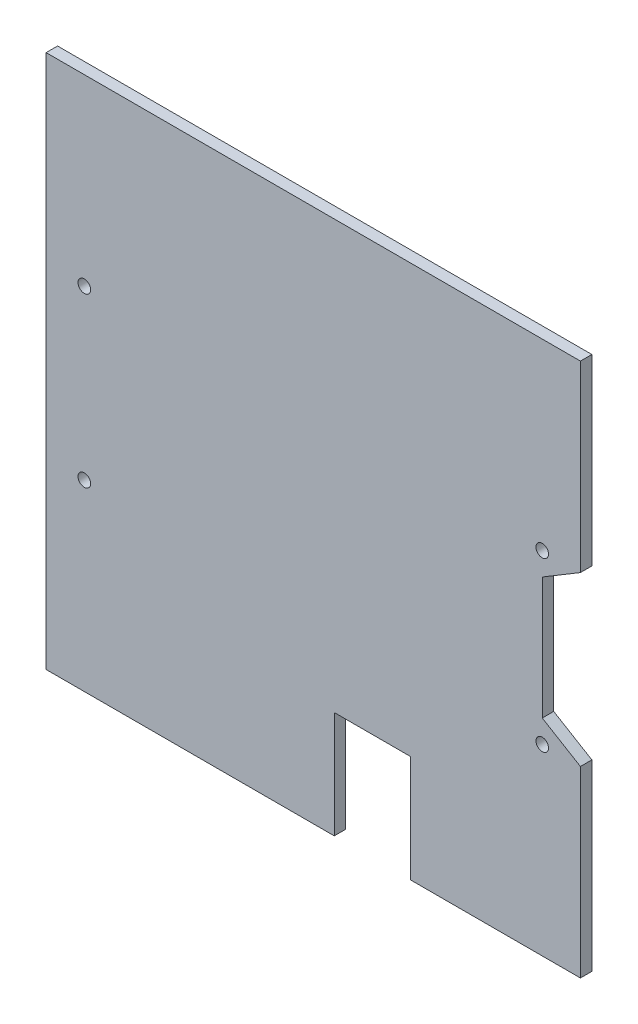
ISO-10303-21;
HEADER;
FILE_DESCRIPTION(('STEP AP214'),'2;1');
FILE_NAME('part.step','',(''),(''),'','','');
FILE_SCHEMA(('AUTOMOTIVE_DESIGN { 1 0 10303 214 1 1 1 1 }'));
ENDSEC;
DATA;
#1=APPLICATION_CONTEXT('core data for automotive mechanical design processes');
#2=APPLICATION_PROTOCOL_DEFINITION('international standard','automotive_design',2000,#1);
#3=PRODUCT_CONTEXT('',#1,'mechanical');
#4=PRODUCT('Part','Part','',(#3));
#5=PRODUCT_RELATED_PRODUCT_CATEGORY('part','',(#4));
#6=PRODUCT_DEFINITION_FORMATION('','',#4);
#7=PRODUCT_DEFINITION_CONTEXT('part definition',#1,'design');
#8=PRODUCT_DEFINITION('design','',#6,#7);
#9=PRODUCT_DEFINITION_SHAPE('','',#8);
#10=(LENGTH_UNIT() NAMED_UNIT(*) SI_UNIT(.MILLI.,.METRE.));
#11=(NAMED_UNIT(*) PLANE_ANGLE_UNIT() SI_UNIT($,.RADIAN.));
#12=(NAMED_UNIT(*) SI_UNIT($,.STERADIAN.) SOLID_ANGLE_UNIT());
#13=UNCERTAINTY_MEASURE_WITH_UNIT(LENGTH_MEASURE(1.E-05),#10,'distance_accuracy_value','');
#14=(GEOMETRIC_REPRESENTATION_CONTEXT(3) GLOBAL_UNCERTAINTY_ASSIGNED_CONTEXT((#13)) GLOBAL_UNIT_ASSIGNED_CONTEXT((#10,
#11,#12)) REPRESENTATION_CONTEXT('',''));
#15=CARTESIAN_POINT('',(0.,0.,0.));
#16=DIRECTION('',(0.,0.,1.));
#17=DIRECTION('',(1.,0.,0.));
#18=AXIS2_PLACEMENT_3D('',#15,#16,#17);
#19=CARTESIAN_POINT('',(0.,-26.,3.));
#20=DIRECTION('',(0.,0.,1.));
#21=DIRECTION('',(1.,0.,0.));
#22=AXIS2_PLACEMENT_3D('',#19,#20,#21);
#23=PLANE('',#22);
#24=CARTESIAN_POINT('',(10.,22.,3.));
#25=DIRECTION('',(0.,0.,1.));
#26=DIRECTION('',(1.,0.,0.));
#27=AXIS2_PLACEMENT_3D('',#24,#25,#26);
#28=CIRCLE('',#27,1.65);
#29=CARTESIAN_POINT('',(11.65,22.,3.));
#30=VERTEX_POINT('',#29);
#31=EDGE_CURVE('E291',#30,#30,#28,.T.);
#32=ORIENTED_EDGE('',*,*,#31,.F.);
#33=EDGE_LOOP('',(#32));
#34=FACE_BOUND('',#33,.T.);
#35=CARTESIAN_POINT('',(130.,66.,3.));
#36=DIRECTION('',(0.,0.,1.));
#37=DIRECTION('',(-1.,0.,0.));
#38=AXIS2_PLACEMENT_3D('',#35,#36,#37);
#39=CIRCLE('',#38,1.65000000000002);
#40=CARTESIAN_POINT('',(128.35,66.,3.));
#41=VERTEX_POINT('',#40);
#42=EDGE_CURVE('E157',#41,#41,#39,.T.);
#43=ORIENTED_EDGE('',*,*,#42,.F.);
#44=EDGE_LOOP('',(#43));
#45=FACE_BOUND('',#44,.T.);
#46=DIRECTION('',(0.,-1.,0.));
#47=VECTOR('',#46,1.);
#48=CARTESIAN_POINT('',(0.,114.,3.));
#49=LINE('',#48,#47);
#50=CARTESIAN_POINT('',(0.,114.,3.));
#51=VERTEX_POINT('',#50);
#52=CARTESIAN_POINT('',(0.,-26.,3.));
#53=VERTEX_POINT('',#52);
#54=EDGE_CURVE('E176',#51,#53,#49,.T.);
#55=ORIENTED_EDGE('',*,*,#54,.T.);
#56=DIRECTION('',(1.,0.,0.));
#57=VECTOR('',#56,1.);
#58=CARTESIAN_POINT('',(0.,-26.,3.));
#59=LINE('',#58,#57);
#60=CARTESIAN_POINT('',(75.5,-26.,3.));
#61=VERTEX_POINT('',#60);
#62=EDGE_CURVE('E104',#53,#61,#59,.T.);
#63=ORIENTED_EDGE('',*,*,#62,.T.);
#64=DIRECTION('',(0.,1.,0.));
#65=VECTOR('',#64,1.);
#66=CARTESIAN_POINT('',(75.5,-26.,3.));
#67=LINE('',#66,#65);
#68=CARTESIAN_POINT('',(75.5,1.99999999999998,3.));
#69=VERTEX_POINT('',#68);
#70=EDGE_CURVE('E203',#61,#69,#67,.T.);
#71=ORIENTED_EDGE('',*,*,#70,.T.);
#72=DIRECTION('',(1.,0.,0.));
#73=VECTOR('',#72,1.);
#74=CARTESIAN_POINT('',(75.5,1.99999999999998,3.));
#75=LINE('',#74,#73);
#76=CARTESIAN_POINT('',(95.5,1.99999999999999,3.));
#77=VERTEX_POINT('',#76);
#78=EDGE_CURVE('E222',#69,#77,#75,.T.);
#79=ORIENTED_EDGE('',*,*,#78,.T.);
#80=DIRECTION('',(0.,-1.,0.));
#81=VECTOR('',#80,1.);
#82=CARTESIAN_POINT('',(95.5,-26.,3.));
#83=LINE('',#82,#81);
#84=CARTESIAN_POINT('',(95.5,-26.,3.));
#85=VERTEX_POINT('',#84);
#86=EDGE_CURVE('E219',#77,#85,#83,.T.);
#87=ORIENTED_EDGE('',*,*,#86,.T.);
#88=DIRECTION('',(1.,0.,0.));
#89=VECTOR('',#88,1.);
#90=CARTESIAN_POINT('',(95.5,-26.,3.));
#91=LINE('',#90,#89);
#92=CARTESIAN_POINT('',(140.,-26.,3.));
#93=VERTEX_POINT('',#92);
#94=EDGE_CURVE('E221',#85,#93,#91,.T.);
#95=ORIENTED_EDGE('',*,*,#94,.T.);
#96=DIRECTION('',(0.,1.,0.));
#97=VECTOR('',#96,1.);
#98=CARTESIAN_POINT('',(140.,-26.,3.));
#99=LINE('',#98,#97);
#100=CARTESIAN_POINT('',(140.,21.9999999999925,3.));
#101=VERTEX_POINT('',#100);
#102=EDGE_CURVE('E224',#93,#101,#99,.T.);
#103=ORIENTED_EDGE('',*,*,#102,.T.);
#104=DIRECTION('',(-0.857492925712261,0.514495755427998,0.));
#105=VECTOR('',#104,1.);
#106=CARTESIAN_POINT('',(130.,28.,3.));
#107=LINE('',#106,#105);
#108=CARTESIAN_POINT('',(130.,28.,3.));
#109=VERTEX_POINT('',#108);
#110=EDGE_CURVE('E230',#101,#109,#107,.T.);
#111=ORIENTED_EDGE('',*,*,#110,.T.);
#112=DIRECTION('',(0.,1.,0.));
#113=VECTOR('',#112,1.);
#114=CARTESIAN_POINT('',(130.,60.,3.));
#115=LINE('',#114,#113);
#116=CARTESIAN_POINT('',(130.,60.,3.));
#117=VERTEX_POINT('',#116);
#118=EDGE_CURVE('E135',#109,#117,#115,.T.);
#119=ORIENTED_EDGE('',*,*,#118,.T.);
#120=DIRECTION('',(0.857492925712262,0.514495755427997,0.));
#121=VECTOR('',#120,1.);
#122=CARTESIAN_POINT('',(130.,60.,3.));
#123=LINE('',#122,#121);
#124=CARTESIAN_POINT('',(140.,66.0000000000075,3.));
#125=VERTEX_POINT('',#124);
#126=EDGE_CURVE('E129',#117,#125,#123,.T.);
#127=ORIENTED_EDGE('',*,*,#126,.T.);
#128=DIRECTION('',(0.,1.,0.));
#129=VECTOR('',#128,1.);
#130=CARTESIAN_POINT('',(140.,114.,3.));
#131=LINE('',#130,#129);
#132=CARTESIAN_POINT('',(140.,114.,3.));
#133=VERTEX_POINT('',#132);
#134=EDGE_CURVE('E133',#125,#133,#131,.T.);
#135=ORIENTED_EDGE('',*,*,#134,.T.);
#136=DIRECTION('',(-1.,0.,0.));
#137=VECTOR('',#136,1.);
#138=CARTESIAN_POINT('',(0.,114.,3.));
#139=LINE('',#138,#137);
#140=EDGE_CURVE('E49',#133,#51,#139,.T.);
#141=ORIENTED_EDGE('',*,*,#140,.T.);
#142=EDGE_LOOP('',(#55,#63,#71,#79,#87,#95,#103,#111,#119,#127,#135,#141));
#143=FACE_BOUND('',#142,.T.);
#144=CARTESIAN_POINT('',(10.,66.,3.));
#145=DIRECTION('',(0.,0.,1.));
#146=DIRECTION('',(-1.,0.,0.));
#147=AXIS2_PLACEMENT_3D('',#144,#145,#146);
#148=CIRCLE('',#147,1.65);
#149=CARTESIAN_POINT('',(8.35000000000001,66.,3.));
#150=VERTEX_POINT('',#149);
#151=EDGE_CURVE('E297',#150,#150,#148,.T.);
#152=ORIENTED_EDGE('',*,*,#151,.F.);
#153=EDGE_LOOP('',(#152));
#154=FACE_BOUND('',#153,.T.);
#155=CARTESIAN_POINT('',(130.,22.,3.));
#156=DIRECTION('',(0.,0.,1.));
#157=DIRECTION('',(1.,0.,0.));
#158=AXIS2_PLACEMENT_3D('',#155,#156,#157);
#159=CIRCLE('',#158,1.65000000000002);
#160=CARTESIAN_POINT('',(131.65,22.,3.));
#161=VERTEX_POINT('',#160);
#162=EDGE_CURVE('E282',#161,#161,#159,.T.);
#163=ORIENTED_EDGE('',*,*,#162,.F.);
#164=EDGE_LOOP('',(#163));
#165=FACE_BOUND('',#164,.T.);
#166=ADVANCED_FACE('F32',(#34,#45,#143,#154,#165),#23,.T.);
#167=CARTESIAN_POINT('',(0.,-26.,0.));
#168=DIRECTION('',(0.,0.,1.));
#169=DIRECTION('',(1.,0.,0.));
#170=AXIS2_PLACEMENT_3D('',#167,#168,#169);
#171=PLANE('',#170);
#172=CARTESIAN_POINT('',(10.,22.,0.));
#173=DIRECTION('',(0.,0.,1.));
#174=DIRECTION('',(1.,0.,0.));
#175=AXIS2_PLACEMENT_3D('',#172,#173,#174);
#176=CIRCLE('',#175,1.65);
#177=CARTESIAN_POINT('',(11.65,22.,0.));
#178=VERTEX_POINT('',#177);
#179=EDGE_CURVE('E288',#178,#178,#176,.T.);
#180=ORIENTED_EDGE('',*,*,#179,.T.);
#181=EDGE_LOOP('',(#180));
#182=FACE_BOUND('',#181,.T.);
#183=CARTESIAN_POINT('',(130.,66.,0.));
#184=DIRECTION('',(0.,0.,1.));
#185=DIRECTION('',(-1.,0.,0.));
#186=AXIS2_PLACEMENT_3D('',#183,#184,#185);
#187=CIRCLE('',#186,1.65000000000002);
#188=CARTESIAN_POINT('',(128.35,66.,0.));
#189=VERTEX_POINT('',#188);
#190=EDGE_CURVE('E300',#189,#189,#187,.T.);
#191=ORIENTED_EDGE('',*,*,#190,.T.);
#192=EDGE_LOOP('',(#191));
#193=FACE_BOUND('',#192,.T.);
#194=DIRECTION('',(0.,-1.,0.));
#195=VECTOR('',#194,1.);
#196=CARTESIAN_POINT('',(0.,114.,0.));
#197=LINE('',#196,#195);
#198=CARTESIAN_POINT('',(0.,114.,0.));
#199=VERTEX_POINT('',#198);
#200=CARTESIAN_POINT('',(0.,-26.,0.));
#201=VERTEX_POINT('',#200);
#202=EDGE_CURVE('E153',#199,#201,#197,.T.);
#203=ORIENTED_EDGE('',*,*,#202,.F.);
#204=DIRECTION('',(-1.,0.,0.));
#205=VECTOR('',#204,1.);
#206=CARTESIAN_POINT('',(0.,114.,0.));
#207=LINE('',#206,#205);
#208=CARTESIAN_POINT('',(140.,114.,0.));
#209=VERTEX_POINT('',#208);
#210=EDGE_CURVE('E96',#209,#199,#207,.T.);
#211=ORIENTED_EDGE('',*,*,#210,.F.);
#212=DIRECTION('',(0.,1.,0.));
#213=VECTOR('',#212,1.);
#214=CARTESIAN_POINT('',(140.,114.,0.));
#215=LINE('',#214,#213);
#216=CARTESIAN_POINT('',(140.,66.0000000000075,0.));
#217=VERTEX_POINT('',#216);
#218=EDGE_CURVE('E90',#217,#209,#215,.T.);
#219=ORIENTED_EDGE('',*,*,#218,.F.);
#220=DIRECTION('',(0.857492925712262,0.514495755427997,0.));
#221=VECTOR('',#220,1.);
#222=CARTESIAN_POINT('',(130.,60.,0.));
#223=LINE('',#222,#221);
#224=CARTESIAN_POINT('',(130.,60.,0.));
#225=VERTEX_POINT('',#224);
#226=EDGE_CURVE('E143',#225,#217,#223,.T.);
#227=ORIENTED_EDGE('',*,*,#226,.F.);
#228=DIRECTION('',(0.,1.,0.));
#229=VECTOR('',#228,1.);
#230=CARTESIAN_POINT('',(130.,60.,0.));
#231=LINE('',#230,#229);
#232=CARTESIAN_POINT('',(130.,28.,0.));
#233=VERTEX_POINT('',#232);
#234=EDGE_CURVE('E171',#233,#225,#231,.T.);
#235=ORIENTED_EDGE('',*,*,#234,.F.);
#236=DIRECTION('',(-0.857492925712261,0.514495755427998,0.));
#237=VECTOR('',#236,1.);
#238=CARTESIAN_POINT('',(130.,28.,0.));
#239=LINE('',#238,#237);
#240=CARTESIAN_POINT('',(140.,21.9999999999925,0.));
#241=VERTEX_POINT('',#240);
#242=EDGE_CURVE('E169',#241,#233,#239,.T.);
#243=ORIENTED_EDGE('',*,*,#242,.F.);
#244=DIRECTION('',(0.,1.,0.));
#245=VECTOR('',#244,1.);
#246=CARTESIAN_POINT('',(140.,-26.,0.));
#247=LINE('',#246,#245);
#248=CARTESIAN_POINT('',(140.,-26.,0.));
#249=VERTEX_POINT('',#248);
#250=EDGE_CURVE('E167',#249,#241,#247,.T.);
#251=ORIENTED_EDGE('',*,*,#250,.F.);
#252=DIRECTION('',(1.,0.,0.));
#253=VECTOR('',#252,1.);
#254=CARTESIAN_POINT('',(95.5,-26.,0.));
#255=LINE('',#254,#253);
#256=CARTESIAN_POINT('',(95.5,-26.,0.));
#257=VERTEX_POINT('',#256);
#258=EDGE_CURVE('E165',#257,#249,#255,.T.);
#259=ORIENTED_EDGE('',*,*,#258,.F.);
#260=DIRECTION('',(0.,-1.,0.));
#261=VECTOR('',#260,1.);
#262=CARTESIAN_POINT('',(95.5,-26.,0.));
#263=LINE('',#262,#261);
#264=CARTESIAN_POINT('',(95.5,1.99999999999999,0.));
#265=VERTEX_POINT('',#264);
#266=EDGE_CURVE('E163',#265,#257,#263,.T.);
#267=ORIENTED_EDGE('',*,*,#266,.F.);
#268=DIRECTION('',(1.,0.,0.));
#269=VECTOR('',#268,1.);
#270=CARTESIAN_POINT('',(75.5,1.99999999999998,0.));
#271=LINE('',#270,#269);
#272=CARTESIAN_POINT('',(75.5,1.99999999999998,0.));
#273=VERTEX_POINT('',#272);
#274=EDGE_CURVE('E161',#273,#265,#271,.T.);
#275=ORIENTED_EDGE('',*,*,#274,.F.);
#276=DIRECTION('',(0.,1.,0.));
#277=VECTOR('',#276,1.);
#278=CARTESIAN_POINT('',(75.5,-26.,0.));
#279=LINE('',#278,#277);
#280=CARTESIAN_POINT('',(75.5,-26.,0.));
#281=VERTEX_POINT('',#280);
#282=EDGE_CURVE('E159',#281,#273,#279,.T.);
#283=ORIENTED_EDGE('',*,*,#282,.F.);
#284=DIRECTION('',(1.,0.,0.));
#285=VECTOR('',#284,1.);
#286=CARTESIAN_POINT('',(0.,-26.,0.));
#287=LINE('',#286,#285);
#288=EDGE_CURVE('E156',#201,#281,#287,.T.);
#289=ORIENTED_EDGE('',*,*,#288,.F.);
#290=EDGE_LOOP('',(#203,#211,#219,#227,#235,#243,#251,#259,#267,#275,#283,#289));
#291=FACE_BOUND('',#290,.T.);
#292=CARTESIAN_POINT('',(10.,66.,0.));
#293=DIRECTION('',(0.,0.,1.));
#294=DIRECTION('',(-1.,0.,0.));
#295=AXIS2_PLACEMENT_3D('',#292,#293,#294);
#296=CIRCLE('',#295,1.65);
#297=CARTESIAN_POINT('',(8.35000000000001,66.,0.));
#298=VERTEX_POINT('',#297);
#299=EDGE_CURVE('E294',#298,#298,#296,.T.);
#300=ORIENTED_EDGE('',*,*,#299,.T.);
#301=EDGE_LOOP('',(#300));
#302=FACE_BOUND('',#301,.T.);
#303=CARTESIAN_POINT('',(130.,22.,0.));
#304=DIRECTION('',(0.,0.,1.));
#305=DIRECTION('',(1.,0.,0.));
#306=AXIS2_PLACEMENT_3D('',#303,#304,#305);
#307=CIRCLE('',#306,1.65000000000002);
#308=CARTESIAN_POINT('',(131.65,22.,0.));
#309=VERTEX_POINT('',#308);
#310=EDGE_CURVE('E285',#309,#309,#307,.T.);
#311=ORIENTED_EDGE('',*,*,#310,.T.);
#312=EDGE_LOOP('',(#311));
#313=FACE_BOUND('',#312,.T.);
#314=ADVANCED_FACE('F207',(#182,#193,#291,#302,#313),#171,.F.);
#315=CARTESIAN_POINT('',(0.,114.,3.));
#316=DIRECTION('',(1.,0.,0.));
#317=DIRECTION('',(0.,1.,0.));
#318=AXIS2_PLACEMENT_3D('',#315,#316,#317);
#319=PLANE('',#318);
#320=ORIENTED_EDGE('',*,*,#202,.T.);
#321=DIRECTION('',(0.,0.,-1.));
#322=VECTOR('',#321,1.);
#323=CARTESIAN_POINT('',(0.,-26.,3.));
#324=LINE('',#323,#322);
#325=EDGE_CURVE('E11',#53,#201,#324,.T.);
#326=ORIENTED_EDGE('',*,*,#325,.F.);
#327=ORIENTED_EDGE('',*,*,#54,.F.);
#328=DIRECTION('',(0.,0.,-1.));
#329=VECTOR('',#328,1.);
#330=CARTESIAN_POINT('',(0.,114.,3.));
#331=LINE('',#330,#329);
#332=EDGE_CURVE('E149',#51,#199,#331,.T.);
#333=ORIENTED_EDGE('',*,*,#332,.T.);
#334=EDGE_LOOP('',(#320,#326,#327,#333));
#335=FACE_BOUND('',#334,.T.);
#336=ADVANCED_FACE('F34',(#335),#319,.F.);
#337=CARTESIAN_POINT('',(0.,-26.,3.));
#338=DIRECTION('',(0.,1.,0.));
#339=DIRECTION('',(-1.,0.,0.));
#340=AXIS2_PLACEMENT_3D('',#337,#338,#339);
#341=PLANE('',#340);
#342=ORIENTED_EDGE('',*,*,#288,.T.);
#343=DIRECTION('',(0.,0.,-1.));
#344=VECTOR('',#343,1.);
#345=CARTESIAN_POINT('',(75.5,-26.,3.));
#346=LINE('',#345,#344);
#347=EDGE_CURVE('E41',#61,#281,#346,.T.);
#348=ORIENTED_EDGE('',*,*,#347,.F.);
#349=ORIENTED_EDGE('',*,*,#62,.F.);
#350=ORIENTED_EDGE('',*,*,#325,.T.);
#351=EDGE_LOOP('',(#342,#348,#349,#350));
#352=FACE_BOUND('',#351,.T.);
#353=ADVANCED_FACE('F409',(#352),#341,.F.);
#354=CARTESIAN_POINT('',(75.5,-26.,3.));
#355=DIRECTION('',(-1.,0.,0.));
#356=DIRECTION('',(0.,0.,1.));
#357=AXIS2_PLACEMENT_3D('',#354,#355,#356);
#358=PLANE('',#357);
#359=ORIENTED_EDGE('',*,*,#282,.T.);
#360=DIRECTION('',(0.,0.,-1.));
#361=VECTOR('',#360,1.);
#362=CARTESIAN_POINT('',(75.5,1.99999999999998,3.));
#363=LINE('',#362,#361);
#364=EDGE_CURVE('E195',#69,#273,#363,.T.);
#365=ORIENTED_EDGE('',*,*,#364,.F.);
#366=ORIENTED_EDGE('',*,*,#70,.F.);
#367=ORIENTED_EDGE('',*,*,#347,.T.);
#368=EDGE_LOOP('',(#359,#365,#366,#367));
#369=FACE_BOUND('',#368,.T.);
#370=ADVANCED_FACE('F201',(#369),#358,.F.);
#371=CARTESIAN_POINT('',(75.5,1.99999999999998,3.));
#372=DIRECTION('',(0.,1.,0.));
#373=DIRECTION('',(-1.,0.,0.));
#374=AXIS2_PLACEMENT_3D('',#371,#372,#373);
#375=PLANE('',#374);
#376=ORIENTED_EDGE('',*,*,#274,.T.);
#377=DIRECTION('',(0.,0.,-1.));
#378=VECTOR('',#377,1.);
#379=CARTESIAN_POINT('',(95.5,1.99999999999999,3.));
#380=LINE('',#379,#378);
#381=EDGE_CURVE('E192',#77,#265,#380,.T.);
#382=ORIENTED_EDGE('',*,*,#381,.F.);
#383=ORIENTED_EDGE('',*,*,#78,.F.);
#384=ORIENTED_EDGE('',*,*,#364,.T.);
#385=EDGE_LOOP('',(#376,#382,#383,#384));
#386=FACE_BOUND('',#385,.T.);
#387=ADVANCED_FACE('F213',(#386),#375,.F.);
#388=CARTESIAN_POINT('',(95.5,-26.,3.));
#389=DIRECTION('',(1.,0.,0.));
#390=DIRECTION('',(0.,1.,0.));
#391=AXIS2_PLACEMENT_3D('',#388,#389,#390);
#392=PLANE('',#391);
#393=ORIENTED_EDGE('',*,*,#266,.T.);
#394=DIRECTION('',(0.,0.,-1.));
#395=VECTOR('',#394,1.);
#396=CARTESIAN_POINT('',(95.5,-26.,3.));
#397=LINE('',#396,#395);
#398=EDGE_CURVE('E189',#85,#257,#397,.T.);
#399=ORIENTED_EDGE('',*,*,#398,.F.);
#400=ORIENTED_EDGE('',*,*,#86,.F.);
#401=ORIENTED_EDGE('',*,*,#381,.T.);
#402=EDGE_LOOP('',(#393,#399,#400,#401));
#403=FACE_BOUND('',#402,.T.);
#404=ADVANCED_FACE('F217',(#403),#392,.F.);
#405=CARTESIAN_POINT('',(95.5,-26.,3.));
#406=DIRECTION('',(0.,1.,0.));
#407=DIRECTION('',(-1.,0.,0.));
#408=AXIS2_PLACEMENT_3D('',#405,#406,#407);
#409=PLANE('',#408);
#410=ORIENTED_EDGE('',*,*,#258,.T.);
#411=DIRECTION('',(0.,0.,-1.));
#412=VECTOR('',#411,1.);
#413=CARTESIAN_POINT('',(140.,-26.,3.));
#414=LINE('',#413,#412);
#415=EDGE_CURVE('E186',#93,#249,#414,.T.);
#416=ORIENTED_EDGE('',*,*,#415,.F.);
#417=ORIENTED_EDGE('',*,*,#94,.F.);
#418=ORIENTED_EDGE('',*,*,#398,.T.);
#419=EDGE_LOOP('',(#410,#416,#417,#418));
#420=FACE_BOUND('',#419,.T.);
#421=ADVANCED_FACE('F374',(#420),#409,.F.);
#422=CARTESIAN_POINT('',(140.,-26.,3.));
#423=DIRECTION('',(-1.,0.,0.));
#424=DIRECTION('',(0.,-1.,0.));
#425=AXIS2_PLACEMENT_3D('',#422,#423,#424);
#426=PLANE('',#425);
#427=ORIENTED_EDGE('',*,*,#250,.T.);
#428=DIRECTION('',(0.,0.,-1.));
#429=VECTOR('',#428,1.);
#430=CARTESIAN_POINT('',(140.,21.9999999999925,3.));
#431=LINE('',#430,#429);
#432=EDGE_CURVE('E183',#101,#241,#431,.T.);
#433=ORIENTED_EDGE('',*,*,#432,.F.);
#434=ORIENTED_EDGE('',*,*,#102,.F.);
#435=ORIENTED_EDGE('',*,*,#415,.T.);
#436=EDGE_LOOP('',(#427,#433,#434,#435));
#437=FACE_BOUND('',#436,.T.);
#438=ADVANCED_FACE('F365',(#437),#426,.F.);
#439=CARTESIAN_POINT('',(130.,28.,3.));
#440=DIRECTION('',(-0.514495755427998,-0.857492925712261,0.));
#441=DIRECTION('',(0.857492925712261,-0.514495755427998,0.));
#442=AXIS2_PLACEMENT_3D('',#439,#440,#441);
#443=PLANE('',#442);
#444=ORIENTED_EDGE('',*,*,#242,.T.);
#445=DIRECTION('',(0.,0.,-1.));
#446=VECTOR('',#445,1.);
#447=CARTESIAN_POINT('',(130.,28.,3.));
#448=LINE('',#447,#446);
#449=EDGE_CURVE('E180',#109,#233,#448,.T.);
#450=ORIENTED_EDGE('',*,*,#449,.F.);
#451=ORIENTED_EDGE('',*,*,#110,.F.);
#452=ORIENTED_EDGE('',*,*,#432,.T.);
#453=EDGE_LOOP('',(#444,#450,#451,#452));
#454=FACE_BOUND('',#453,.T.);
#455=ADVANCED_FACE('F236',(#454),#443,.F.);
#456=CARTESIAN_POINT('',(130.,60.,3.));
#457=DIRECTION('',(-1.,0.,0.));
#458=DIRECTION('',(0.,0.,1.));
#459=AXIS2_PLACEMENT_3D('',#456,#457,#458);
#460=PLANE('',#459);
#461=ORIENTED_EDGE('',*,*,#234,.T.);
#462=DIRECTION('',(0.,0.,-1.));
#463=VECTOR('',#462,1.);
#464=CARTESIAN_POINT('',(130.,60.,3.));
#465=LINE('',#464,#463);
#466=EDGE_CURVE('E144',#117,#225,#465,.T.);
#467=ORIENTED_EDGE('',*,*,#466,.F.);
#468=ORIENTED_EDGE('',*,*,#118,.F.);
#469=ORIENTED_EDGE('',*,*,#449,.T.);
#470=EDGE_LOOP('',(#461,#467,#468,#469));
#471=FACE_BOUND('',#470,.T.);
#472=ADVANCED_FACE('F240',(#471),#460,.F.);
#473=CARTESIAN_POINT('',(130.,60.,3.));
#474=DIRECTION('',(-0.514495755427998,0.857492925712262,0.));
#475=DIRECTION('',(-0.857492925712262,-0.514495755427998,0.));
#476=AXIS2_PLACEMENT_3D('',#473,#474,#475);
#477=PLANE('',#476);
#478=ORIENTED_EDGE('',*,*,#226,.T.);
#479=DIRECTION('',(0.,0.,-1.));
#480=VECTOR('',#479,1.);
#481=CARTESIAN_POINT('',(140.,66.0000000000075,3.));
#482=LINE('',#481,#480);
#483=EDGE_CURVE('E140',#125,#217,#482,.T.);
#484=ORIENTED_EDGE('',*,*,#483,.F.);
#485=ORIENTED_EDGE('',*,*,#126,.F.);
#486=ORIENTED_EDGE('',*,*,#466,.T.);
#487=EDGE_LOOP('',(#478,#484,#485,#486));
#488=FACE_BOUND('',#487,.T.);
#489=ADVANCED_FACE('F141',(#488),#477,.F.);
#490=CARTESIAN_POINT('',(140.,114.,3.));
#491=DIRECTION('',(-1.,0.,0.));
#492=DIRECTION('',(0.,0.,1.));
#493=AXIS2_PLACEMENT_3D('',#490,#491,#492);
#494=PLANE('',#493);
#495=ORIENTED_EDGE('',*,*,#218,.T.);
#496=DIRECTION('',(0.,0.,-1.));
#497=VECTOR('',#496,1.);
#498=CARTESIAN_POINT('',(140.,114.,3.));
#499=LINE('',#498,#497);
#500=EDGE_CURVE('E145',#133,#209,#499,.T.);
#501=ORIENTED_EDGE('',*,*,#500,.F.);
#502=ORIENTED_EDGE('',*,*,#134,.F.);
#503=ORIENTED_EDGE('',*,*,#483,.T.);
#504=EDGE_LOOP('',(#495,#501,#502,#503));
#505=FACE_BOUND('',#504,.T.);
#506=ADVANCED_FACE('F147',(#505),#494,.F.);
#507=CARTESIAN_POINT('',(0.,114.,3.));
#508=DIRECTION('',(0.,-1.,0.));
#509=DIRECTION('',(1.,0.,0.));
#510=AXIS2_PLACEMENT_3D('',#507,#508,#509);
#511=PLANE('',#510);
#512=ORIENTED_EDGE('',*,*,#210,.T.);
#513=ORIENTED_EDGE('',*,*,#332,.F.);
#514=ORIENTED_EDGE('',*,*,#140,.F.);
#515=ORIENTED_EDGE('',*,*,#500,.T.);
#516=EDGE_LOOP('',(#512,#513,#514,#515));
#517=FACE_BOUND('',#516,.T.);
#518=ADVANCED_FACE('F244',(#517),#511,.F.);
#519=CARTESIAN_POINT('',(130.,66.,3.));
#520=DIRECTION('',(0.,0.,-1.));
#521=DIRECTION('',(-1.,0.,0.));
#522=AXIS2_PLACEMENT_3D('',#519,#520,#521);
#523=CYLINDRICAL_SURFACE('',#522,1.65000000000002);
#524=ORIENTED_EDGE('',*,*,#42,.T.);
#525=EDGE_LOOP('',(#524));
#526=FACE_BOUND('',#525,.T.);
#527=ORIENTED_EDGE('',*,*,#190,.F.);
#528=EDGE_LOOP('',(#527));
#529=FACE_BOUND('',#528,.T.);
#530=ADVANCED_FACE('F246',(#526,#529),#523,.F.);
#531=CARTESIAN_POINT('',(10.,66.,3.));
#532=DIRECTION('',(0.,0.,-1.));
#533=DIRECTION('',(-1.,0.,0.));
#534=AXIS2_PLACEMENT_3D('',#531,#532,#533);
#535=CYLINDRICAL_SURFACE('',#534,1.65);
#536=ORIENTED_EDGE('',*,*,#151,.T.);
#537=EDGE_LOOP('',(#536));
#538=FACE_BOUND('',#537,.T.);
#539=ORIENTED_EDGE('',*,*,#299,.F.);
#540=EDGE_LOOP('',(#539));
#541=FACE_BOUND('',#540,.T.);
#542=ADVANCED_FACE('F252',(#538,#541),#535,.F.);
#543=CARTESIAN_POINT('',(10.,22.,3.));
#544=DIRECTION('',(0.,0.,-1.));
#545=DIRECTION('',(-1.,0.,0.));
#546=AXIS2_PLACEMENT_3D('',#543,#544,#545);
#547=CYLINDRICAL_SURFACE('',#546,1.65);
#548=ORIENTED_EDGE('',*,*,#31,.T.);
#549=EDGE_LOOP('',(#548));
#550=FACE_BOUND('',#549,.T.);
#551=ORIENTED_EDGE('',*,*,#179,.F.);
#552=EDGE_LOOP('',(#551));
#553=FACE_BOUND('',#552,.T.);
#554=ADVANCED_FACE('F269',(#550,#553),#547,.F.);
#555=CARTESIAN_POINT('',(130.,22.,3.));
#556=DIRECTION('',(0.,0.,-1.));
#557=DIRECTION('',(-1.,0.,0.));
#558=AXIS2_PLACEMENT_3D('',#555,#556,#557);
#559=CYLINDRICAL_SURFACE('',#558,1.65000000000002);
#560=ORIENTED_EDGE('',*,*,#162,.T.);
#561=EDGE_LOOP('',(#560));
#562=FACE_BOUND('',#561,.T.);
#563=ORIENTED_EDGE('',*,*,#310,.F.);
#564=EDGE_LOOP('',(#563));
#565=FACE_BOUND('',#564,.T.);
#566=ADVANCED_FACE('F273',(#562,#565),#559,.F.);
#567=CLOSED_SHELL('',(#166,#314,#336,#353,#370,#387,#404,#421,#438,#455,#472,#489,#506,#518,
#530,#542,#554,#566));
#568=MANIFOLD_SOLID_BREP('B2',#567);
#569=ADVANCED_BREP_SHAPE_REPRESENTATION('',(#18,#568),#14);
#570=SHAPE_DEFINITION_REPRESENTATION(#9,#569);
ENDSEC;
END-ISO-10303-21;
